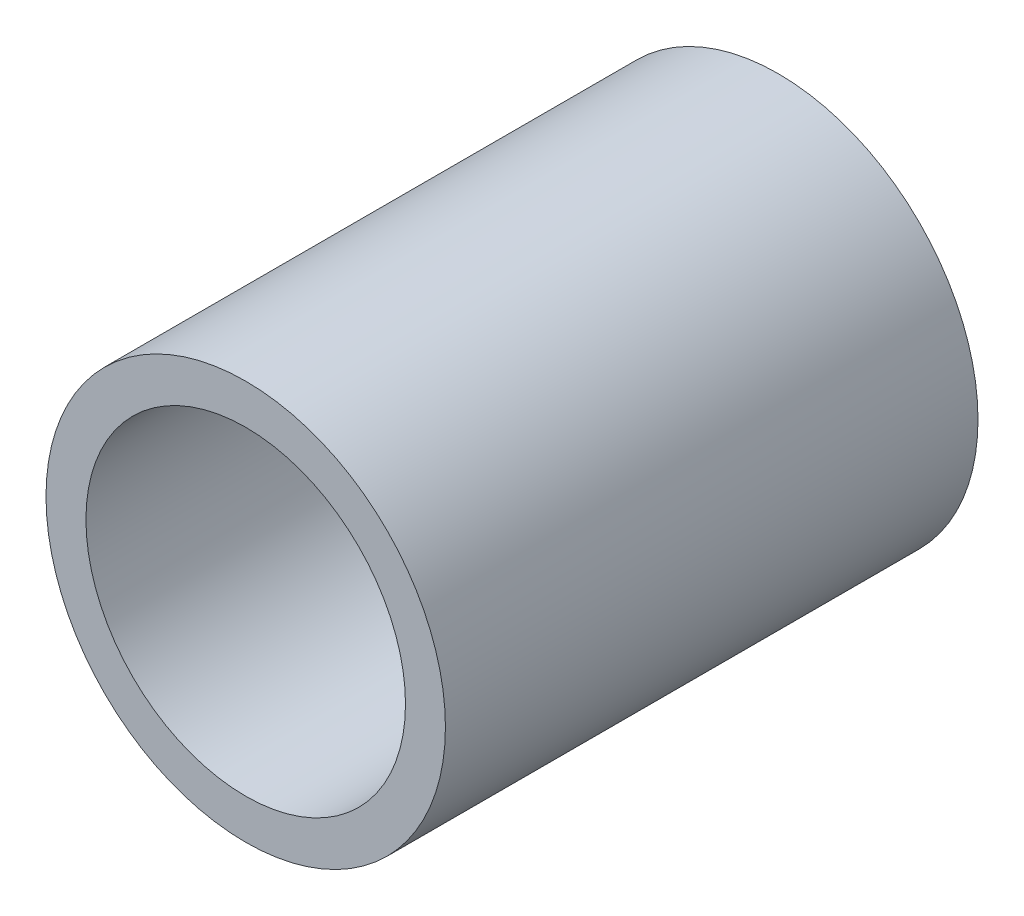
ISO-10303-21;
HEADER;
FILE_DESCRIPTION(('STEP AP214'),'2;1');
FILE_NAME('part.step','',(''),(''),'','','');
FILE_SCHEMA(('AUTOMOTIVE_DESIGN { 1 0 10303 214 1 1 1 1 }'));
ENDSEC;
DATA;
#1=APPLICATION_CONTEXT('core data for automotive mechanical design processes');
#2=APPLICATION_PROTOCOL_DEFINITION('international standard','automotive_design',2000,#1);
#3=PRODUCT_CONTEXT('',#1,'mechanical');
#4=PRODUCT('Part','Part','',(#3));
#5=PRODUCT_RELATED_PRODUCT_CATEGORY('part','',(#4));
#6=PRODUCT_DEFINITION_FORMATION('','',#4);
#7=PRODUCT_DEFINITION_CONTEXT('part definition',#1,'design');
#8=PRODUCT_DEFINITION('design','',#6,#7);
#9=PRODUCT_DEFINITION_SHAPE('','',#8);
#10=(LENGTH_UNIT() NAMED_UNIT(*) SI_UNIT(.MILLI.,.METRE.));
#11=(NAMED_UNIT(*) PLANE_ANGLE_UNIT() SI_UNIT($,.RADIAN.));
#12=(NAMED_UNIT(*) SI_UNIT($,.STERADIAN.) SOLID_ANGLE_UNIT());
#13=UNCERTAINTY_MEASURE_WITH_UNIT(LENGTH_MEASURE(1.E-05),#10,'distance_accuracy_value','');
#14=(GEOMETRIC_REPRESENTATION_CONTEXT(3) GLOBAL_UNCERTAINTY_ASSIGNED_CONTEXT((#13)) GLOBAL_UNIT_ASSIGNED_CONTEXT((#10,
#11,#12)) REPRESENTATION_CONTEXT('',''));
#15=CARTESIAN_POINT('',(0.,0.,0.));
#16=DIRECTION('',(0.,0.,1.));
#17=DIRECTION('',(1.,0.,0.));
#18=AXIS2_PLACEMENT_3D('',#15,#16,#17);
#19=CARTESIAN_POINT('',(0.,0.,10.));
#20=DIRECTION('',(0.,0.,1.));
#21=DIRECTION('',(1.,0.,0.));
#22=AXIS2_PLACEMENT_3D('',#19,#20,#21);
#23=PLANE('',#22);
#24=CARTESIAN_POINT('',(0.,0.,10.));
#25=DIRECTION('',(0.,0.,1.));
#26=DIRECTION('',(1.,0.,0.));
#27=AXIS2_PLACEMENT_3D('',#24,#25,#26);
#28=CIRCLE('',#27,7.5);
#29=CARTESIAN_POINT('',(7.5,0.,10.));
#30=VERTEX_POINT('',#29);
#31=EDGE_CURVE('E10',#30,#30,#28,.T.);
#32=ORIENTED_EDGE('',*,*,#31,.T.);
#33=EDGE_LOOP('',(#32));
#34=FACE_BOUND('',#33,.T.);
#35=CARTESIAN_POINT('',(0.,0.,10.));
#36=DIRECTION('',(0.,0.,1.));
#37=DIRECTION('',(1.,0.,0.));
#38=AXIS2_PLACEMENT_3D('',#35,#36,#37);
#39=CIRCLE('',#38,6.);
#40=CARTESIAN_POINT('',(6.,0.,10.));
#41=VERTEX_POINT('',#40);
#42=EDGE_CURVE('E48',#41,#41,#39,.T.);
#43=ORIENTED_EDGE('',*,*,#42,.F.);
#44=EDGE_LOOP('',(#43));
#45=FACE_BOUND('',#44,.T.);
#46=ADVANCED_FACE('F37',(#34,#45),#23,.T.);
#47=CARTESIAN_POINT('',(0.,0.,-10.));
#48=DIRECTION('',(0.,0.,1.));
#49=DIRECTION('',(1.,0.,0.));
#50=AXIS2_PLACEMENT_3D('',#47,#48,#49);
#51=PLANE('',#50);
#52=CARTESIAN_POINT('',(0.,0.,-10.));
#53=DIRECTION('',(0.,0.,1.));
#54=DIRECTION('',(1.,0.,0.));
#55=AXIS2_PLACEMENT_3D('',#52,#53,#54);
#56=CIRCLE('',#55,7.5);
#57=CARTESIAN_POINT('',(7.5,0.,-10.));
#58=VERTEX_POINT('',#57);
#59=EDGE_CURVE('E41',#58,#58,#56,.T.);
#60=ORIENTED_EDGE('',*,*,#59,.F.);
#61=EDGE_LOOP('',(#60));
#62=FACE_BOUND('',#61,.T.);
#63=CARTESIAN_POINT('',(0.,0.,-10.));
#64=DIRECTION('',(0.,0.,1.));
#65=DIRECTION('',(1.,0.,0.));
#66=AXIS2_PLACEMENT_3D('',#63,#64,#65);
#67=CIRCLE('',#66,6.);
#68=CARTESIAN_POINT('',(6.,0.,-10.));
#69=VERTEX_POINT('',#68);
#70=EDGE_CURVE('E50',#69,#69,#67,.T.);
#71=ORIENTED_EDGE('',*,*,#70,.T.);
#72=EDGE_LOOP('',(#71));
#73=FACE_BOUND('',#72,.T.);
#74=ADVANCED_FACE('F60',(#62,#73),#51,.F.);
#75=CARTESIAN_POINT('',(0.,0.,10.));
#76=DIRECTION('',(0.,0.,-1.));
#77=DIRECTION('',(-1.,0.,0.));
#78=AXIS2_PLACEMENT_3D('',#75,#76,#77);
#79=CYLINDRICAL_SURFACE('',#78,7.5);
#80=ORIENTED_EDGE('',*,*,#31,.F.);
#81=EDGE_LOOP('',(#80));
#82=FACE_BOUND('',#81,.T.);
#83=ORIENTED_EDGE('',*,*,#59,.T.);
#84=EDGE_LOOP('',(#83));
#85=FACE_BOUND('',#84,.T.);
#86=ADVANCED_FACE('F39',(#82,#85),#79,.T.);
#87=CARTESIAN_POINT('',(0.,0.,10.));
#88=DIRECTION('',(0.,0.,-1.));
#89=DIRECTION('',(-1.,0.,0.));
#90=AXIS2_PLACEMENT_3D('',#87,#88,#89);
#91=CYLINDRICAL_SURFACE('',#90,6.);
#92=ORIENTED_EDGE('',*,*,#42,.T.);
#93=EDGE_LOOP('',(#92));
#94=FACE_BOUND('',#93,.T.);
#95=ORIENTED_EDGE('',*,*,#70,.F.);
#96=EDGE_LOOP('',(#95));
#97=FACE_BOUND('',#96,.T.);
#98=ADVANCED_FACE('F56',(#94,#97),#91,.F.);
#99=CLOSED_SHELL('',(#46,#74,#86,#98));
#100=MANIFOLD_SOLID_BREP('B2',#99);
#101=ADVANCED_BREP_SHAPE_REPRESENTATION('',(#18,#100),#14);
#102=SHAPE_DEFINITION_REPRESENTATION(#9,#101);
ENDSEC;
END-ISO-10303-21;
